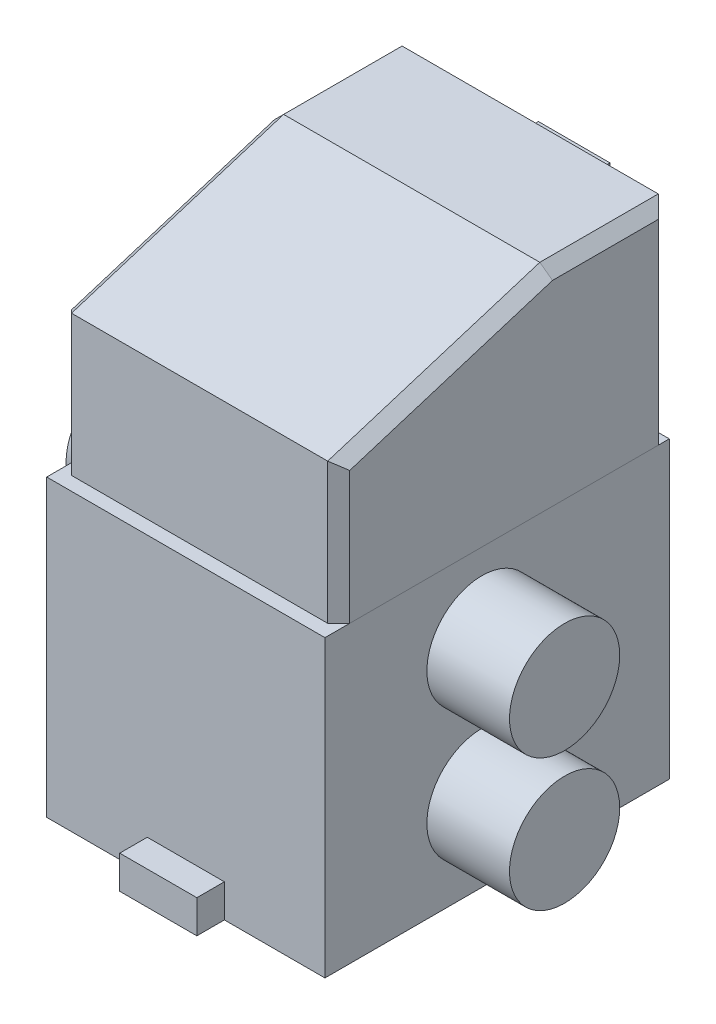
ISO-10303-21;
HEADER;
FILE_DESCRIPTION(('STEP AP214'),'2;1');
FILE_NAME('part.step','',(''),(''),'','','');
FILE_SCHEMA(('AUTOMOTIVE_DESIGN { 1 0 10303 214 1 1 1 1 }'));
ENDSEC;
DATA;
#1=APPLICATION_CONTEXT('core data for automotive mechanical design processes');
#2=APPLICATION_PROTOCOL_DEFINITION('international standard','automotive_design',2000,#1);
#3=PRODUCT_CONTEXT('',#1,'mechanical');
#4=PRODUCT('Part','Part','',(#3));
#5=PRODUCT_RELATED_PRODUCT_CATEGORY('part','',(#4));
#6=PRODUCT_DEFINITION_FORMATION('','',#4);
#7=PRODUCT_DEFINITION_CONTEXT('part definition',#1,'design');
#8=PRODUCT_DEFINITION('design','',#6,#7);
#9=PRODUCT_DEFINITION_SHAPE('','',#8);
#10=(LENGTH_UNIT() NAMED_UNIT(*) SI_UNIT(.MILLI.,.METRE.));
#11=(NAMED_UNIT(*) PLANE_ANGLE_UNIT() SI_UNIT($,.RADIAN.));
#12=(NAMED_UNIT(*) SI_UNIT($,.STERADIAN.) SOLID_ANGLE_UNIT());
#13=UNCERTAINTY_MEASURE_WITH_UNIT(LENGTH_MEASURE(1.E-05),#10,'distance_accuracy_value','');
#14=(GEOMETRIC_REPRESENTATION_CONTEXT(3) GLOBAL_UNCERTAINTY_ASSIGNED_CONTEXT((#13)) GLOBAL_UNIT_ASSIGNED_CONTEXT((#10,
#11,#12)) REPRESENTATION_CONTEXT('',''));
#15=CARTESIAN_POINT('',(0.,0.,0.));
#16=DIRECTION('',(0.,0.,1.));
#17=DIRECTION('',(1.,0.,0.));
#18=AXIS2_PLACEMENT_3D('',#15,#16,#17);
#19=CARTESIAN_POINT('',(252.5,535.,0.));
#20=DIRECTION('',(0.,0.,1.));
#21=DIRECTION('',(1.,0.,0.));
#22=AXIS2_PLACEMENT_3D('',#19,#20,#21);
#23=PLANE('',#22);
#24=DIRECTION('',(-1.,0.,0.));
#25=VECTOR('',#24,1.);
#26=CARTESIAN_POINT('',(252.5,535.,0.));
#27=LINE('',#26,#25);
#28=CARTESIAN_POINT('',(232.5,535.,0.));
#29=VERTEX_POINT('',#28);
#30=CARTESIAN_POINT('',(-232.5,535.,0.));
#31=VERTEX_POINT('',#30);
#32=EDGE_CURVE('E197',#29,#31,#27,.T.);
#33=ORIENTED_EDGE('',*,*,#32,.T.);
#34=DIRECTION('',(0.,1.,0.));
#35=VECTOR('',#34,1.);
#36=CARTESIAN_POINT('',(-232.5,535.,0.));
#37=LINE('',#36,#35);
#38=CARTESIAN_POINT('',(-232.5,910.,0.));
#39=VERTEX_POINT('',#38);
#40=EDGE_CURVE('E208',#31,#39,#37,.T.);
#41=ORIENTED_EDGE('',*,*,#40,.T.);
#42=DIRECTION('',(-1.,0.,0.));
#43=VECTOR('',#42,1.);
#44=CARTESIAN_POINT('',(252.5,910.,0.));
#45=LINE('',#44,#43);
#46=CARTESIAN_POINT('',(232.5,910.,0.));
#47=VERTEX_POINT('',#46);
#48=EDGE_CURVE('E194',#47,#39,#45,.T.);
#49=ORIENTED_EDGE('',*,*,#48,.F.);
#50=DIRECTION('',(0.,-1.,0.));
#51=VECTOR('',#50,1.);
#52=CARTESIAN_POINT('',(232.5,535.,0.));
#53=LINE('',#52,#51);
#54=EDGE_CURVE('E206',#47,#29,#53,.T.);
#55=ORIENTED_EDGE('',*,*,#54,.T.);
#56=EDGE_LOOP('',(#33,#41,#49,#55));
#57=FACE_BOUND('',#56,.T.);
#58=DIRECTION('',(0.,-1.,0.));
#59=VECTOR('',#58,1.);
#60=CARTESIAN_POINT('',(65.,835.,0.));
#61=LINE('',#60,#59);
#62=CARTESIAN_POINT('',(65.,835.,0.));
#63=VERTEX_POINT('',#62);
#64=CARTESIAN_POINT('',(65.,705.,0.));
#65=VERTEX_POINT('',#64);
#66=EDGE_CURVE('E70',#63,#65,#61,.T.);
#67=ORIENTED_EDGE('',*,*,#66,.F.);
#68=DIRECTION('',(1.,0.,0.));
#69=VECTOR('',#68,1.);
#70=CARTESIAN_POINT('',(65.,835.,0.));
#71=LINE('',#70,#69);
#72=CARTESIAN_POINT('',(-65.,835.,0.));
#73=VERTEX_POINT('',#72);
#74=EDGE_CURVE('E74',#73,#63,#71,.T.);
#75=ORIENTED_EDGE('',*,*,#74,.F.);
#76=DIRECTION('',(0.,1.,0.));
#77=VECTOR('',#76,1.);
#78=CARTESIAN_POINT('',(-65.,835.,0.));
#79=LINE('',#78,#77);
#80=CARTESIAN_POINT('',(-65.,705.,0.));
#81=VERTEX_POINT('',#80);
#82=EDGE_CURVE('E579',#81,#73,#79,.T.);
#83=ORIENTED_EDGE('',*,*,#82,.F.);
#84=DIRECTION('',(-1.,0.,0.));
#85=VECTOR('',#84,1.);
#86=CARTESIAN_POINT('',(65.,705.,0.));
#87=LINE('',#86,#85);
#88=EDGE_CURVE('E585',#65,#81,#87,.T.);
#89=ORIENTED_EDGE('',*,*,#88,.F.);
#90=EDGE_LOOP('',(#67,#75,#83,#89));
#91=FACE_BOUND('',#90,.T.);
#92=ADVANCED_FACE('F52',(#57,#91),#23,.F.);
#93=CARTESIAN_POINT('',(252.5,910.,215.));
#94=DIRECTION('',(0.,-0.954700334487348,-0.297568935424628));
#95=DIRECTION('',(0.,0.297568935424628,-0.954700334487348));
#96=AXIS2_PLACEMENT_3D('',#93,#94,#95);
#97=PLANE('',#96);
#98=DIRECTION('',(-1.,0.,0.));
#99=VECTOR('',#98,1.);
#100=CARTESIAN_POINT('',(252.5,910.,215.));
#101=LINE('',#100,#99);
#102=CARTESIAN_POINT('',(232.5,910.,215.));
#103=VERTEX_POINT('',#102);
#104=CARTESIAN_POINT('',(-232.5,910.,215.));
#105=VERTEX_POINT('',#104);
#106=EDGE_CURVE('E187',#103,#105,#101,.T.);
#107=ORIENTED_EDGE('',*,*,#106,.T.);
#108=DIRECTION('',(0.,-0.297568935424628,0.954700334487348));
#109=VECTOR('',#108,1.);
#110=CARTESIAN_POINT('',(-232.5,910.,215.));
#111=LINE('',#110,#109);
#112=CARTESIAN_POINT('',(-232.5,790.,600.));
#113=VERTEX_POINT('',#112);
#114=EDGE_CURVE('E233',#105,#113,#111,.T.);
#115=ORIENTED_EDGE('',*,*,#114,.T.);
#116=DIRECTION('',(-1.,0.,0.));
#117=VECTOR('',#116,1.);
#118=CARTESIAN_POINT('',(252.5,790.,600.));
#119=LINE('',#118,#117);
#120=CARTESIAN_POINT('',(232.5,790.,600.));
#121=VERTEX_POINT('',#120);
#122=EDGE_CURVE('E203',#121,#113,#119,.T.);
#123=ORIENTED_EDGE('',*,*,#122,.F.);
#124=DIRECTION('',(0.,0.297568935424628,-0.954700334487348));
#125=VECTOR('',#124,1.);
#126=CARTESIAN_POINT('',(232.5,910.,215.));
#127=LINE('',#126,#125);
#128=EDGE_CURVE('E231',#121,#103,#127,.T.);
#129=ORIENTED_EDGE('',*,*,#128,.T.);
#130=EDGE_LOOP('',(#107,#115,#123,#129));
#131=FACE_BOUND('',#130,.T.);
#132=ADVANCED_FACE('F297',(#131),#97,.F.);
#133=CARTESIAN_POINT('',(252.5,790.,600.));
#134=DIRECTION('',(0.,0.,-1.));
#135=DIRECTION('',(-1.,0.,0.));
#136=AXIS2_PLACEMENT_3D('',#133,#134,#135);
#137=PLANE('',#136);
#138=ORIENTED_EDGE('',*,*,#122,.T.);
#139=DIRECTION('',(0.,-1.,0.));
#140=VECTOR('',#139,1.);
#141=CARTESIAN_POINT('',(-232.5,790.,600.));
#142=LINE('',#141,#140);
#143=CARTESIAN_POINT('',(-232.5,535.,600.));
#144=VERTEX_POINT('',#143);
#145=EDGE_CURVE('E237',#113,#144,#142,.T.);
#146=ORIENTED_EDGE('',*,*,#145,.T.);
#147=DIRECTION('',(-1.,0.,0.));
#148=VECTOR('',#147,1.);
#149=CARTESIAN_POINT('',(252.5,535.,600.));
#150=LINE('',#149,#148);
#151=CARTESIAN_POINT('',(232.5,535.,600.));
#152=VERTEX_POINT('',#151);
#153=EDGE_CURVE('E200',#152,#144,#150,.T.);
#154=ORIENTED_EDGE('',*,*,#153,.F.);
#155=DIRECTION('',(0.,1.,0.));
#156=VECTOR('',#155,1.);
#157=CARTESIAN_POINT('',(232.5,790.,600.));
#158=LINE('',#157,#156);
#159=EDGE_CURVE('E235',#152,#121,#158,.T.);
#160=ORIENTED_EDGE('',*,*,#159,.T.);
#161=EDGE_LOOP('',(#138,#146,#154,#160));
#162=FACE_BOUND('',#161,.T.);
#163=ADVANCED_FACE('F309',(#162),#137,.F.);
#164=CARTESIAN_POINT('',(252.5,535.,600.));
#165=DIRECTION('',(0.,1.,0.));
#166=DIRECTION('',(0.,0.,1.));
#167=AXIS2_PLACEMENT_3D('',#164,#165,#166);
#168=PLANE('',#167);
#169=DIRECTION('',(0.,0.,-1.));
#170=VECTOR('',#169,1.);
#171=CARTESIAN_POINT('',(-252.5,535.,600.));
#172=LINE('',#171,#170);
#173=CARTESIAN_POINT('',(-252.5,535.,580.));
#174=VERTEX_POINT('',#173);
#175=CARTESIAN_POINT('',(-252.5,535.,20.0000000000001));
#176=VERTEX_POINT('',#175);
#177=EDGE_CURVE('E188',#174,#176,#172,.T.);
#178=ORIENTED_EDGE('',*,*,#177,.T.);
#179=DIRECTION('',(-0.707106781186546,0.,0.707106781186549));
#180=VECTOR('',#179,1.);
#181=CARTESIAN_POINT('',(-232.5,535.,0.));
#182=LINE('',#181,#180);
#183=EDGE_CURVE('E225',#176,#31,#182,.F.);
#184=ORIENTED_EDGE('',*,*,#183,.T.);
#185=ORIENTED_EDGE('',*,*,#32,.F.);
#186=DIRECTION('',(0.707106781186546,0.,0.707106781186549));
#187=VECTOR('',#186,1.);
#188=CARTESIAN_POINT('',(252.5,535.,20.0000000000001));
#189=LINE('',#188,#187);
#190=CARTESIAN_POINT('',(252.5,535.,20.0000000000001));
#191=VERTEX_POINT('',#190);
#192=EDGE_CURVE('E221',#29,#191,#189,.T.);
#193=ORIENTED_EDGE('',*,*,#192,.T.);
#194=DIRECTION('',(0.,0.,-1.));
#195=VECTOR('',#194,1.);
#196=CARTESIAN_POINT('',(252.5,535.,600.));
#197=LINE('',#196,#195);
#198=CARTESIAN_POINT('',(252.5,535.,580.));
#199=VERTEX_POINT('',#198);
#200=EDGE_CURVE('E184',#199,#191,#197,.T.);
#201=ORIENTED_EDGE('',*,*,#200,.F.);
#202=DIRECTION('',(-0.707106781186546,0.,0.707106781186549));
#203=VECTOR('',#202,1.);
#204=CARTESIAN_POINT('',(252.5,535.,580.));
#205=LINE('',#204,#203);
#206=EDGE_CURVE('E219',#199,#152,#205,.T.);
#207=ORIENTED_EDGE('',*,*,#206,.T.);
#208=ORIENTED_EDGE('',*,*,#153,.T.);
#209=DIRECTION('',(0.707106781186546,0.,0.707106781186549));
#210=VECTOR('',#209,1.);
#211=CARTESIAN_POINT('',(-232.5,535.,600.));
#212=LINE('',#211,#210);
#213=EDGE_CURVE('E223',#144,#174,#212,.F.);
#214=ORIENTED_EDGE('',*,*,#213,.T.);
#215=EDGE_LOOP('',(#178,#184,#185,#193,#201,#207,#208,#214));
#216=FACE_BOUND('',#215,.T.);
#217=ADVANCED_FACE('F270',(#216),#168,.F.);
#218=CARTESIAN_POINT('',(252.5,910.,0.));
#219=DIRECTION('',(0.,-1.,0.));
#220=DIRECTION('',(0.,0.,-1.));
#221=AXIS2_PLACEMENT_3D('',#218,#219,#220);
#222=PLANE('',#221);
#223=ORIENTED_EDGE('',*,*,#48,.T.);
#224=DIRECTION('',(0.,0.,1.));
#225=VECTOR('',#224,1.);
#226=CARTESIAN_POINT('',(-232.5,910.,0.));
#227=LINE('',#226,#225);
#228=EDGE_CURVE('E229',#39,#105,#227,.T.);
#229=ORIENTED_EDGE('',*,*,#228,.T.);
#230=ORIENTED_EDGE('',*,*,#106,.F.);
#231=DIRECTION('',(0.,0.,-1.));
#232=VECTOR('',#231,1.);
#233=CARTESIAN_POINT('',(232.5,910.,0.));
#234=LINE('',#233,#232);
#235=EDGE_CURVE('E227',#103,#47,#234,.T.);
#236=ORIENTED_EDGE('',*,*,#235,.T.);
#237=EDGE_LOOP('',(#223,#229,#230,#236));
#238=FACE_BOUND('',#237,.T.);
#239=ADVANCED_FACE('F282',(#238),#222,.F.);
#240=CARTESIAN_POINT('',(252.5,0.,0.));
#241=DIRECTION('',(1.,0.,0.));
#242=DIRECTION('',(0.,0.,-1.));
#243=AXIS2_PLACEMENT_3D('',#240,#241,#242);
#244=PLANE('',#243);
#245=ORIENTED_EDGE('',*,*,#200,.T.);
#246=DIRECTION('',(0.,1.,0.));
#247=VECTOR('',#246,1.);
#248=CARTESIAN_POINT('',(252.5,910.,20.0000000000001));
#249=LINE('',#248,#247);
#250=CARTESIAN_POINT('',(252.5,890.,20.0000000000001));
#251=VERTEX_POINT('',#250);
#252=EDGE_CURVE('E12',#191,#251,#249,.T.);
#253=ORIENTED_EDGE('',*,*,#252,.T.);
#254=DIRECTION('',(0.,0.,1.));
#255=VECTOR('',#254,1.);
#256=CARTESIAN_POINT('',(252.5,890.,215.));
#257=LINE('',#256,#255);
#258=CARTESIAN_POINT('',(252.5,890.,211.955349828569));
#259=VERTEX_POINT('',#258);
#260=EDGE_CURVE('E62',#251,#259,#257,.T.);
#261=ORIENTED_EDGE('',*,*,#260,.T.);
#262=DIRECTION('',(0.,-0.297568935424628,0.954700334487348));
#263=VECTOR('',#262,1.);
#264=CARTESIAN_POINT('',(252.5,770.905993310253,594.048621291507));
#265=LINE('',#264,#263);
#266=CARTESIAN_POINT('',(252.5,775.284784362151,580.));
#267=VERTEX_POINT('',#266);
#268=EDGE_CURVE('E241',#259,#267,#265,.T.);
#269=ORIENTED_EDGE('',*,*,#268,.T.);
#270=DIRECTION('',(0.,-1.,0.));
#271=VECTOR('',#270,1.);
#272=CARTESIAN_POINT('',(252.5,535.,580.));
#273=LINE('',#272,#271);
#274=EDGE_CURVE('E239',#267,#199,#273,.T.);
#275=ORIENTED_EDGE('',*,*,#274,.T.);
#276=EDGE_LOOP('',(#245,#253,#261,#269,#275));
#277=FACE_BOUND('',#276,.T.);
#278=ADVANCED_FACE('F267',(#277),#244,.T.);
#279=CARTESIAN_POINT('',(-252.5,0.,0.));
#280=DIRECTION('',(1.,0.,0.));
#281=DIRECTION('',(0.,0.,-1.));
#282=AXIS2_PLACEMENT_3D('',#279,#280,#281);
#283=PLANE('',#282);
#284=DIRECTION('',(0.,0.,-1.));
#285=VECTOR('',#284,1.);
#286=CARTESIAN_POINT('',(-252.5,890.,0.));
#287=LINE('',#286,#285);
#288=CARTESIAN_POINT('',(-252.5,890.,211.955349828569));
#289=VERTEX_POINT('',#288);
#290=CARTESIAN_POINT('',(-252.5,890.,20.0000000000001));
#291=VERTEX_POINT('',#290);
#292=EDGE_CURVE('E215',#289,#291,#287,.T.);
#293=ORIENTED_EDGE('',*,*,#292,.T.);
#294=DIRECTION('',(0.,-1.,0.));
#295=VECTOR('',#294,1.);
#296=CARTESIAN_POINT('',(-252.5,0.,20.0000000000001));
#297=LINE('',#296,#295);
#298=EDGE_CURVE('E217',#291,#176,#297,.T.);
#299=ORIENTED_EDGE('',*,*,#298,.T.);
#300=ORIENTED_EDGE('',*,*,#177,.F.);
#301=DIRECTION('',(0.,1.,0.));
#302=VECTOR('',#301,1.);
#303=CARTESIAN_POINT('',(-252.5,0.,580.));
#304=LINE('',#303,#302);
#305=CARTESIAN_POINT('',(-252.5,775.284784362151,580.));
#306=VERTEX_POINT('',#305);
#307=EDGE_CURVE('E211',#174,#306,#304,.T.);
#308=ORIENTED_EDGE('',*,*,#307,.T.);
#309=DIRECTION('',(0.,0.297568935424628,-0.954700334487348));
#310=VECTOR('',#309,1.);
#311=CARTESIAN_POINT('',(-252.5,871.407146269515,271.607422213875));
#312=LINE('',#311,#310);
#313=EDGE_CURVE('E213',#306,#289,#312,.T.);
#314=ORIENTED_EDGE('',*,*,#313,.T.);
#315=EDGE_LOOP('',(#293,#299,#300,#308,#314));
#316=FACE_BOUND('',#315,.T.);
#317=ADVANCED_FACE('F312',(#316),#283,.F.);
#318=CARTESIAN_POINT('',(-232.5,790.,600.));
#319=DIRECTION('',(0.707106781186549,0.,-0.707106781186545));
#320=DIRECTION('',(0.,-1.,0.));
#321=AXIS2_PLACEMENT_3D('',#318,#319,#320);
#322=PLANE('',#321);
#323=ORIENTED_EDGE('',*,*,#213,.F.);
#324=ORIENTED_EDGE('',*,*,#145,.F.);
#325=DIRECTION('',(-0.627289875797286,-0.461535289489815,-0.627289875797289));
#326=VECTOR('',#325,1.);
#327=CARTESIAN_POINT('',(-232.5,790.,600.));
#328=LINE('',#327,#326);
#329=EDGE_CURVE('E191',#306,#113,#328,.F.);
#330=ORIENTED_EDGE('',*,*,#329,.F.);
#331=ORIENTED_EDGE('',*,*,#307,.F.);
#332=EDGE_LOOP('',(#323,#324,#330,#331));
#333=FACE_BOUND('',#332,.T.);
#334=ADVANCED_FACE('F307',(#333),#322,.F.);
#335=CARTESIAN_POINT('',(-232.5,910.,215.));
#336=DIRECTION('',(0.707106781186549,-0.675075080517068,-0.210413012109216));
#337=DIRECTION('',(0.,-0.297568935424628,0.954700334487348));
#338=AXIS2_PLACEMENT_3D('',#335,#336,#337);
#339=PLANE('',#338);
#340=ORIENTED_EDGE('',*,*,#329,.T.);
#341=ORIENTED_EDGE('',*,*,#114,.F.);
#342=DIRECTION('',(-0.703045290429658,-0.703045290429662,-0.107026348201505));
#343=VECTOR('',#342,1.);
#344=CARTESIAN_POINT('',(-232.5,910.,215.));
#345=LINE('',#344,#343);
#346=EDGE_CURVE('E246',#289,#105,#345,.F.);
#347=ORIENTED_EDGE('',*,*,#346,.F.);
#348=ORIENTED_EDGE('',*,*,#313,.F.);
#349=EDGE_LOOP('',(#340,#341,#347,#348));
#350=FACE_BOUND('',#349,.T.);
#351=ADVANCED_FACE('F300',(#350),#339,.F.);
#352=CARTESIAN_POINT('',(-232.5,910.,0.));
#353=DIRECTION('',(0.707106781186549,-0.707106781186545,0.));
#354=DIRECTION('',(0.,0.,1.));
#355=AXIS2_PLACEMENT_3D('',#352,#353,#354);
#356=PLANE('',#355);
#357=ORIENTED_EDGE('',*,*,#346,.T.);
#358=ORIENTED_EDGE('',*,*,#228,.F.);
#359=DIRECTION('',(-0.577350269189624,-0.577350269189627,0.577350269189627));
#360=VECTOR('',#359,1.);
#361=CARTESIAN_POINT('',(-232.5,910.,0.));
#362=LINE('',#361,#360);
#363=EDGE_CURVE('E244',#291,#39,#362,.F.);
#364=ORIENTED_EDGE('',*,*,#363,.F.);
#365=ORIENTED_EDGE('',*,*,#292,.F.);
#366=EDGE_LOOP('',(#357,#358,#364,#365));
#367=FACE_BOUND('',#366,.T.);
#368=ADVANCED_FACE('F293',(#367),#356,.F.);
#369=CARTESIAN_POINT('',(-232.5,535.,0.));
#370=DIRECTION('',(0.707106781186549,0.,0.707106781186545));
#371=DIRECTION('',(0.,1.,0.));
#372=AXIS2_PLACEMENT_3D('',#369,#370,#371);
#373=PLANE('',#372);
#374=ORIENTED_EDGE('',*,*,#183,.F.);
#375=ORIENTED_EDGE('',*,*,#298,.F.);
#376=ORIENTED_EDGE('',*,*,#363,.T.);
#377=ORIENTED_EDGE('',*,*,#40,.F.);
#378=EDGE_LOOP('',(#374,#375,#376,#377));
#379=FACE_BOUND('',#378,.T.);
#380=ADVANCED_FACE('F287',(#379),#373,.F.);
#381=CARTESIAN_POINT('',(252.5,0.,580.));
#382=DIRECTION('',(0.707106781186549,0.,0.707106781186545));
#383=DIRECTION('',(0.,1.,0.));
#384=AXIS2_PLACEMENT_3D('',#381,#382,#383);
#385=PLANE('',#384);
#386=ORIENTED_EDGE('',*,*,#206,.F.);
#387=ORIENTED_EDGE('',*,*,#274,.F.);
#388=DIRECTION('',(-0.627289875797286,0.461535289489815,0.627289875797289));
#389=VECTOR('',#388,1.);
#390=CARTESIAN_POINT('',(476.957670923014,610.137632902081,355.542329076985));
#391=LINE('',#390,#389);
#392=EDGE_CURVE('E57',#121,#267,#391,.F.);
#393=ORIENTED_EDGE('',*,*,#392,.F.);
#394=ORIENTED_EDGE('',*,*,#159,.F.);
#395=EDGE_LOOP('',(#386,#387,#393,#394));
#396=FACE_BOUND('',#395,.T.);
#397=ADVANCED_FACE('F55',(#396),#385,.T.);
#398=CARTESIAN_POINT('',(252.5,871.407146269515,271.607422213875));
#399=DIRECTION('',(0.707106781186549,0.675075080517068,0.210413012109216));
#400=DIRECTION('',(0.,0.297568935424628,-0.954700334487348));
#401=AXIS2_PLACEMENT_3D('',#398,#399,#400);
#402=PLANE('',#401);
#403=ORIENTED_EDGE('',*,*,#392,.T.);
#404=ORIENTED_EDGE('',*,*,#268,.F.);
#405=DIRECTION('',(-0.703045290429658,0.703045290429662,0.107026348201505));
#406=VECTOR('',#405,1.);
#407=CARTESIAN_POINT('',(257.20145704046,885.29854295954,211.239635229359));
#408=LINE('',#407,#406);
#409=EDGE_CURVE('E178',#103,#259,#408,.F.);
#410=ORIENTED_EDGE('',*,*,#409,.F.);
#411=ORIENTED_EDGE('',*,*,#128,.F.);
#412=EDGE_LOOP('',(#403,#404,#410,#411));
#413=FACE_BOUND('',#412,.T.);
#414=ADVANCED_FACE('F260',(#413),#402,.T.);
#415=CARTESIAN_POINT('',(252.5,890.,0.));
#416=DIRECTION('',(0.707106781186549,0.707106781186545,0.));
#417=DIRECTION('',(0.,0.,-1.));
#418=AXIS2_PLACEMENT_3D('',#415,#416,#417);
#419=PLANE('',#418);
#420=ORIENTED_EDGE('',*,*,#409,.T.);
#421=ORIENTED_EDGE('',*,*,#260,.F.);
#422=DIRECTION('',(-0.577350269189624,0.577350269189627,-0.577350269189627));
#423=VECTOR('',#422,1.);
#424=CARTESIAN_POINT('',(245.833333333333,896.666666666667,13.3333333333334));
#425=LINE('',#424,#423);
#426=EDGE_CURVE('E176',#47,#251,#425,.F.);
#427=ORIENTED_EDGE('',*,*,#426,.F.);
#428=ORIENTED_EDGE('',*,*,#235,.F.);
#429=EDGE_LOOP('',(#420,#421,#427,#428));
#430=FACE_BOUND('',#429,.T.);
#431=ADVANCED_FACE('F278',(#430),#419,.T.);
#432=CARTESIAN_POINT('',(252.5,0.,20.0000000000001));
#433=DIRECTION('',(0.707106781186549,0.,-0.707106781186545));
#434=DIRECTION('',(0.,-1.,0.));
#435=AXIS2_PLACEMENT_3D('',#432,#433,#434);
#436=PLANE('',#435);
#437=ORIENTED_EDGE('',*,*,#192,.F.);
#438=ORIENTED_EDGE('',*,*,#54,.F.);
#439=ORIENTED_EDGE('',*,*,#426,.T.);
#440=ORIENTED_EDGE('',*,*,#252,.F.);
#441=EDGE_LOOP('',(#437,#438,#439,#440));
#442=FACE_BOUND('',#441,.T.);
#443=ADVANCED_FACE('F276',(#442),#436,.T.);
#444=CARTESIAN_POINT('',(65.,835.,-80.));
#445=DIRECTION('',(-1.,0.,0.));
#446=DIRECTION('',(0.,-1.,0.));
#447=AXIS2_PLACEMENT_3D('',#444,#445,#446);
#448=PLANE('',#447);
#449=ORIENTED_EDGE('',*,*,#66,.T.);
#450=DIRECTION('',(0.,0.,1.));
#451=VECTOR('',#450,1.);
#452=CARTESIAN_POINT('',(65.,705.,-80.));
#453=LINE('',#452,#451);
#454=CARTESIAN_POINT('',(65.,705.,-80.));
#455=VERTEX_POINT('',#454);
#456=EDGE_CURVE('E159',#455,#65,#453,.T.);
#457=ORIENTED_EDGE('',*,*,#456,.F.);
#458=DIRECTION('',(0.,-1.,0.));
#459=VECTOR('',#458,1.);
#460=CARTESIAN_POINT('',(65.,835.,-80.));
#461=LINE('',#460,#459);
#462=CARTESIAN_POINT('',(65.,835.,-80.));
#463=VERTEX_POINT('',#462);
#464=EDGE_CURVE('E165',#463,#455,#461,.T.);
#465=ORIENTED_EDGE('',*,*,#464,.F.);
#466=DIRECTION('',(0.,0.,1.));
#467=VECTOR('',#466,1.);
#468=CARTESIAN_POINT('',(65.,835.,-80.));
#469=LINE('',#468,#467);
#470=EDGE_CURVE('E577',#463,#63,#469,.T.);
#471=ORIENTED_EDGE('',*,*,#470,.T.);
#472=EDGE_LOOP('',(#449,#457,#465,#471));
#473=FACE_BOUND('',#472,.T.);
#474=ADVANCED_FACE('F175',(#473),#448,.F.);
#475=CARTESIAN_POINT('',(65.,705.,-80.));
#476=DIRECTION('',(0.,1.,0.));
#477=DIRECTION('',(0.,0.,1.));
#478=AXIS2_PLACEMENT_3D('',#475,#476,#477);
#479=PLANE('',#478);
#480=ORIENTED_EDGE('',*,*,#88,.T.);
#481=DIRECTION('',(0.,0.,1.));
#482=VECTOR('',#481,1.);
#483=CARTESIAN_POINT('',(-65.,705.,-80.));
#484=LINE('',#483,#482);
#485=CARTESIAN_POINT('',(-65.,705.,-80.));
#486=VERTEX_POINT('',#485);
#487=EDGE_CURVE('E161',#486,#81,#484,.T.);
#488=ORIENTED_EDGE('',*,*,#487,.F.);
#489=DIRECTION('',(-1.,0.,0.));
#490=VECTOR('',#489,1.);
#491=CARTESIAN_POINT('',(65.,705.,-80.));
#492=LINE('',#491,#490);
#493=EDGE_CURVE('E154',#455,#486,#492,.T.);
#494=ORIENTED_EDGE('',*,*,#493,.F.);
#495=ORIENTED_EDGE('',*,*,#456,.T.);
#496=EDGE_LOOP('',(#480,#488,#494,#495));
#497=FACE_BOUND('',#496,.T.);
#498=ADVANCED_FACE('F157',(#497),#479,.F.);
#499=CARTESIAN_POINT('',(-65.,835.,-80.));
#500=DIRECTION('',(1.,0.,0.));
#501=DIRECTION('',(0.,1.,0.));
#502=AXIS2_PLACEMENT_3D('',#499,#500,#501);
#503=PLANE('',#502);
#504=ORIENTED_EDGE('',*,*,#82,.T.);
#505=DIRECTION('',(0.,0.,1.));
#506=VECTOR('',#505,1.);
#507=CARTESIAN_POINT('',(-65.,835.,-80.));
#508=LINE('',#507,#506);
#509=CARTESIAN_POINT('',(-65.,835.,-80.));
#510=VERTEX_POINT('',#509);
#511=EDGE_CURVE('E180',#510,#73,#508,.T.);
#512=ORIENTED_EDGE('',*,*,#511,.F.);
#513=DIRECTION('',(0.,1.,0.));
#514=VECTOR('',#513,1.);
#515=CARTESIAN_POINT('',(-65.,835.,-80.));
#516=LINE('',#515,#514);
#517=EDGE_CURVE('E164',#486,#510,#516,.T.);
#518=ORIENTED_EDGE('',*,*,#517,.F.);
#519=ORIENTED_EDGE('',*,*,#487,.T.);
#520=EDGE_LOOP('',(#504,#512,#518,#519));
#521=FACE_BOUND('',#520,.T.);
#522=ADVANCED_FACE('F452',(#521),#503,.F.);
#523=CARTESIAN_POINT('',(65.,835.,-80.));
#524=DIRECTION('',(0.,-1.,0.));
#525=DIRECTION('',(0.,0.,-1.));
#526=AXIS2_PLACEMENT_3D('',#523,#524,#525);
#527=PLANE('',#526);
#528=ORIENTED_EDGE('',*,*,#74,.T.);
#529=ORIENTED_EDGE('',*,*,#470,.F.);
#530=DIRECTION('',(1.,0.,0.));
#531=VECTOR('',#530,1.);
#532=CARTESIAN_POINT('',(65.,835.,-80.));
#533=LINE('',#532,#531);
#534=EDGE_CURVE('E170',#510,#463,#533,.T.);
#535=ORIENTED_EDGE('',*,*,#534,.F.);
#536=ORIENTED_EDGE('',*,*,#511,.T.);
#537=EDGE_LOOP('',(#528,#529,#535,#536));
#538=FACE_BOUND('',#537,.T.);
#539=ADVANCED_FACE('F463',(#538),#527,.F.);
#540=CARTESIAN_POINT('',(0.,0.,-80.));
#541=DIRECTION('',(0.,0.,-1.));
#542=DIRECTION('',(-1.,0.,0.));
#543=AXIS2_PLACEMENT_3D('',#540,#541,#542);
#544=PLANE('',#543);
#545=ORIENTED_EDGE('',*,*,#464,.T.);
#546=ORIENTED_EDGE('',*,*,#493,.T.);
#547=ORIENTED_EDGE('',*,*,#517,.T.);
#548=ORIENTED_EDGE('',*,*,#534,.T.);
#549=EDGE_LOOP('',(#545,#546,#547,#548));
#550=FACE_BOUND('',#549,.T.);
#551=ADVANCED_FACE('F168',(#550),#544,.T.);
#552=CLOSED_SHELL('',(#92,#132,#163,#217,#239,#278,#317,#334,#351,#368,#380,#397,#414,#431,#443,
#474,#498,#522,#539,#551));
#553=MANIFOLD_SOLID_BREP('B2',#552);
#554=CARTESIAN_POINT('',(402.5,150.,340.));
#555=DIRECTION('',(-1.,0.,0.));
#556=DIRECTION('',(0.,0.,1.));
#557=AXIS2_PLACEMENT_3D('',#554,#555,#556);
#558=CYLINDRICAL_SURFACE('',#557,100.);
#559=CARTESIAN_POINT('',(402.5,150.,340.));
#560=DIRECTION('',(1.,0.,0.));
#561=DIRECTION('',(0.,0.,-1.));
#562=AXIS2_PLACEMENT_3D('',#559,#560,#561);
#563=CIRCLE('',#562,100.);
#564=CARTESIAN_POINT('',(402.5,150.,240.));
#565=VERTEX_POINT('',#564);
#566=EDGE_CURVE('E605',#565,#565,#563,.T.);
#567=ORIENTED_EDGE('',*,*,#566,.F.);
#568=EDGE_LOOP('',(#567));
#569=FACE_BOUND('',#568,.T.);
#570=CARTESIAN_POINT('',(252.5,150.,340.));
#571=DIRECTION('',(1.,0.,0.));
#572=DIRECTION('',(0.,0.,-1.));
#573=AXIS2_PLACEMENT_3D('',#570,#571,#572);
#574=CIRCLE('',#573,100.);
#575=CARTESIAN_POINT('',(252.5,150.,240.));
#576=VERTEX_POINT('',#575);
#577=EDGE_CURVE('E51',#576,#576,#574,.T.);
#578=ORIENTED_EDGE('',*,*,#577,.T.);
#579=EDGE_LOOP('',(#578));
#580=FACE_BOUND('',#579,.T.);
#581=ADVANCED_FACE('F601',(#569,#580),#558,.T.);
#582=CARTESIAN_POINT('',(402.5,150.,340.));
#583=DIRECTION('',(1.,0.,0.));
#584=DIRECTION('',(0.,0.,-1.));
#585=AXIS2_PLACEMENT_3D('',#582,#583,#584);
#586=PLANE('',#585);
#587=ORIENTED_EDGE('',*,*,#566,.T.);
#588=EDGE_LOOP('',(#587));
#589=FACE_BOUND('',#588,.T.);
#590=ADVANCED_FACE('F603',(#589),#586,.T.);
#591=CARTESIAN_POINT('',(252.5,150.,340.));
#592=DIRECTION('',(1.,0.,0.));
#593=DIRECTION('',(0.,0.,-1.));
#594=AXIS2_PLACEMENT_3D('',#591,#592,#593);
#595=PLANE('',#594);
#596=ORIENTED_EDGE('',*,*,#577,.F.);
#597=EDGE_LOOP('',(#596));
#598=FACE_BOUND('',#597,.T.);
#599=ADVANCED_FACE('F620',(#598),#595,.F.);
#600=CLOSED_SHELL('',(#581,#590,#599));
#601=MANIFOLD_SOLID_BREP('B6',#600);
#602=CARTESIAN_POINT('',(402.5,390.,340.));
#603=DIRECTION('',(-1.,0.,0.));
#604=DIRECTION('',(0.,0.,1.));
#605=AXIS2_PLACEMENT_3D('',#602,#603,#604);
#606=CYLINDRICAL_SURFACE('',#605,100.);
#607=CARTESIAN_POINT('',(402.5,390.,340.));
#608=DIRECTION('',(1.,0.,0.));
#609=DIRECTION('',(0.,0.,-1.));
#610=AXIS2_PLACEMENT_3D('',#607,#608,#609);
#611=CIRCLE('',#610,100.);
#612=CARTESIAN_POINT('',(402.5,390.,240.));
#613=VERTEX_POINT('',#612);
#614=EDGE_CURVE('E600',#613,#613,#611,.T.);
#615=ORIENTED_EDGE('',*,*,#614,.F.);
#616=EDGE_LOOP('',(#615));
#617=FACE_BOUND('',#616,.T.);
#618=CARTESIAN_POINT('',(252.5,390.,340.));
#619=DIRECTION('',(1.,0.,0.));
#620=DIRECTION('',(0.,0.,-1.));
#621=AXIS2_PLACEMENT_3D('',#618,#619,#620);
#622=CIRCLE('',#621,100.);
#623=CARTESIAN_POINT('',(252.5,390.,240.));
#624=VERTEX_POINT('',#623);
#625=EDGE_CURVE('E665',#624,#624,#622,.T.);
#626=ORIENTED_EDGE('',*,*,#625,.T.);
#627=EDGE_LOOP('',(#626));
#628=FACE_BOUND('',#627,.T.);
#629=ADVANCED_FACE('F662',(#617,#628),#606,.T.);
#630=CARTESIAN_POINT('',(402.5,390.,340.));
#631=DIRECTION('',(1.,0.,0.));
#632=DIRECTION('',(0.,0.,-1.));
#633=AXIS2_PLACEMENT_3D('',#630,#631,#632);
#634=PLANE('',#633);
#635=ORIENTED_EDGE('',*,*,#614,.T.);
#636=EDGE_LOOP('',(#635));
#637=FACE_BOUND('',#636,.T.);
#638=ADVANCED_FACE('F677',(#637),#634,.T.);
#639=CARTESIAN_POINT('',(252.5,390.,340.));
#640=DIRECTION('',(1.,0.,0.));
#641=DIRECTION('',(0.,0.,-1.));
#642=AXIS2_PLACEMENT_3D('',#639,#640,#641);
#643=PLANE('',#642);
#644=ORIENTED_EDGE('',*,*,#625,.F.);
#645=EDGE_LOOP('',(#644));
#646=FACE_BOUND('',#645,.T.);
#647=ADVANCED_FACE('F675',(#646),#643,.F.);
#648=CLOSED_SHELL('',(#629,#638,#647));
#649=MANIFOLD_SOLID_BREP('B46',#648);
#650=CARTESIAN_POINT('',(-402.5,150.,340.));
#651=DIRECTION('',(1.,0.,0.));
#652=DIRECTION('',(0.,0.,-1.));
#653=AXIS2_PLACEMENT_3D('',#650,#651,#652);
#654=CYLINDRICAL_SURFACE('',#653,100.);
#655=CARTESIAN_POINT('',(-402.5,150.,340.));
#656=DIRECTION('',(-1.,0.,0.));
#657=DIRECTION('',(0.,0.,1.));
#658=AXIS2_PLACEMENT_3D('',#655,#656,#657);
#659=CIRCLE('',#658,100.);
#660=CARTESIAN_POINT('',(-402.5,150.,440.));
#661=VERTEX_POINT('',#660);
#662=EDGE_CURVE('E727',#661,#661,#659,.T.);
#663=ORIENTED_EDGE('',*,*,#662,.F.);
#664=EDGE_LOOP('',(#663));
#665=FACE_BOUND('',#664,.T.);
#666=CARTESIAN_POINT('',(-252.5,150.,340.));
#667=DIRECTION('',(-1.,0.,0.));
#668=DIRECTION('',(0.,0.,1.));
#669=AXIS2_PLACEMENT_3D('',#666,#667,#668);
#670=CIRCLE('',#669,100.);
#671=CARTESIAN_POINT('',(-252.5,150.,440.));
#672=VERTEX_POINT('',#671);
#673=EDGE_CURVE('E661',#672,#672,#670,.T.);
#674=ORIENTED_EDGE('',*,*,#673,.T.);
#675=EDGE_LOOP('',(#674));
#676=FACE_BOUND('',#675,.T.);
#677=ADVANCED_FACE('F723',(#665,#676),#654,.T.);
#678=CARTESIAN_POINT('',(-402.5,150.,340.));
#679=DIRECTION('',(-1.,0.,0.));
#680=DIRECTION('',(0.,0.,1.));
#681=AXIS2_PLACEMENT_3D('',#678,#679,#680);
#682=PLANE('',#681);
#683=ORIENTED_EDGE('',*,*,#662,.T.);
#684=EDGE_LOOP('',(#683));
#685=FACE_BOUND('',#684,.T.);
#686=ADVANCED_FACE('F725',(#685),#682,.T.);
#687=CARTESIAN_POINT('',(-252.5,150.,340.));
#688=DIRECTION('',(-1.,0.,0.));
#689=DIRECTION('',(0.,0.,1.));
#690=AXIS2_PLACEMENT_3D('',#687,#688,#689);
#691=PLANE('',#690);
#692=ORIENTED_EDGE('',*,*,#673,.F.);
#693=EDGE_LOOP('',(#692));
#694=FACE_BOUND('',#693,.T.);
#695=ADVANCED_FACE('F742',(#694),#691,.F.);
#696=CLOSED_SHELL('',(#677,#686,#695));
#697=MANIFOLD_SOLID_BREP('B595',#696);
#698=CARTESIAN_POINT('',(-402.5,190.,95.));
#699=DIRECTION('',(1.,0.,0.));
#700=DIRECTION('',(0.,0.,-1.));
#701=AXIS2_PLACEMENT_3D('',#698,#699,#700);
#702=CYLINDRICAL_SURFACE('',#701,100.);
#703=CARTESIAN_POINT('',(-402.5,190.,95.));
#704=DIRECTION('',(-1.,0.,0.));
#705=DIRECTION('',(0.,0.,1.));
#706=AXIS2_PLACEMENT_3D('',#703,#704,#705);
#707=CIRCLE('',#706,100.);
#708=CARTESIAN_POINT('',(-402.5,190.,195.));
#709=VERTEX_POINT('',#708);
#710=EDGE_CURVE('E788',#709,#709,#707,.T.);
#711=ORIENTED_EDGE('',*,*,#710,.F.);
#712=EDGE_LOOP('',(#711));
#713=FACE_BOUND('',#712,.T.);
#714=CARTESIAN_POINT('',(-252.5,190.,95.));
#715=DIRECTION('',(-1.,0.,0.));
#716=DIRECTION('',(0.,0.,1.));
#717=AXIS2_PLACEMENT_3D('',#714,#715,#716);
#718=CIRCLE('',#717,100.);
#719=CARTESIAN_POINT('',(-252.5,190.,195.));
#720=VERTEX_POINT('',#719);
#721=EDGE_CURVE('E722',#720,#720,#718,.T.);
#722=ORIENTED_EDGE('',*,*,#721,.T.);
#723=EDGE_LOOP('',(#722));
#724=FACE_BOUND('',#723,.T.);
#725=ADVANCED_FACE('F784',(#713,#724),#702,.T.);
#726=CARTESIAN_POINT('',(-402.5,190.,95.));
#727=DIRECTION('',(-1.,0.,0.));
#728=DIRECTION('',(0.,0.,1.));
#729=AXIS2_PLACEMENT_3D('',#726,#727,#728);
#730=PLANE('',#729);
#731=ORIENTED_EDGE('',*,*,#710,.T.);
#732=EDGE_LOOP('',(#731));
#733=FACE_BOUND('',#732,.T.);
#734=ADVANCED_FACE('F786',(#733),#730,.T.);
#735=CARTESIAN_POINT('',(-252.5,190.,95.));
#736=DIRECTION('',(-1.,0.,0.));
#737=DIRECTION('',(0.,0.,1.));
#738=AXIS2_PLACEMENT_3D('',#735,#736,#737);
#739=PLANE('',#738);
#740=ORIENTED_EDGE('',*,*,#721,.F.);
#741=EDGE_LOOP('',(#740));
#742=FACE_BOUND('',#741,.T.);
#743=ADVANCED_FACE('F803',(#742),#739,.F.);
#744=CLOSED_SHELL('',(#725,#734,#743));
#745=MANIFOLD_SOLID_BREP('B656',#744);
#746=CARTESIAN_POINT('',(-402.5,390.,340.));
#747=DIRECTION('',(1.,0.,0.));
#748=DIRECTION('',(0.,0.,-1.));
#749=AXIS2_PLACEMENT_3D('',#746,#747,#748);
#750=CYLINDRICAL_SURFACE('',#749,100.);
#751=CARTESIAN_POINT('',(-402.5,390.,340.));
#752=DIRECTION('',(-1.,0.,0.));
#753=DIRECTION('',(0.,0.,1.));
#754=AXIS2_PLACEMENT_3D('',#751,#752,#753);
#755=CIRCLE('',#754,100.);
#756=CARTESIAN_POINT('',(-402.5,390.,440.));
#757=VERTEX_POINT('',#756);
#758=EDGE_CURVE('E783',#757,#757,#755,.T.);
#759=ORIENTED_EDGE('',*,*,#758,.F.);
#760=EDGE_LOOP('',(#759));
#761=FACE_BOUND('',#760,.T.);
#762=CARTESIAN_POINT('',(-252.5,390.,340.));
#763=DIRECTION('',(-1.,0.,0.));
#764=DIRECTION('',(0.,0.,1.));
#765=AXIS2_PLACEMENT_3D('',#762,#763,#764);
#766=CIRCLE('',#765,100.);
#767=CARTESIAN_POINT('',(-252.5,390.,440.));
#768=VERTEX_POINT('',#767);
#769=EDGE_CURVE('E849',#768,#768,#766,.T.);
#770=ORIENTED_EDGE('',*,*,#769,.T.);
#771=EDGE_LOOP('',(#770));
#772=FACE_BOUND('',#771,.T.);
#773=ADVANCED_FACE('F846',(#761,#772),#750,.T.);
#774=CARTESIAN_POINT('',(-402.5,390.,340.));
#775=DIRECTION('',(-1.,0.,0.));
#776=DIRECTION('',(0.,0.,1.));
#777=AXIS2_PLACEMENT_3D('',#774,#775,#776);
#778=PLANE('',#777);
#779=ORIENTED_EDGE('',*,*,#758,.T.);
#780=EDGE_LOOP('',(#779));
#781=FACE_BOUND('',#780,.T.);
#782=ADVANCED_FACE('F861',(#781),#778,.T.);
#783=CARTESIAN_POINT('',(-252.5,390.,340.));
#784=DIRECTION('',(-1.,0.,0.));
#785=DIRECTION('',(0.,0.,1.));
#786=AXIS2_PLACEMENT_3D('',#783,#784,#785);
#787=PLANE('',#786);
#788=ORIENTED_EDGE('',*,*,#769,.F.);
#789=EDGE_LOOP('',(#788));
#790=FACE_BOUND('',#789,.T.);
#791=ADVANCED_FACE('F859',(#790),#787,.F.);
#792=CLOSED_SHELL('',(#773,#782,#791));
#793=MANIFOLD_SOLID_BREP('B717',#792);
#794=CARTESIAN_POINT('',(0.,0.,625.));
#795=DIRECTION('',(0.,0.,-1.));
#796=DIRECTION('',(-1.,0.,0.));
#797=AXIS2_PLACEMENT_3D('',#794,#795,#796);
#798=PLANE('',#797);
#799=DIRECTION('',(0.,1.,0.));
#800=VECTOR('',#799,1.);
#801=CARTESIAN_POINT('',(70.,0.,625.));
#802=LINE('',#801,#800);
#803=CARTESIAN_POINT('',(70.,0.,625.));
#804=VERTEX_POINT('',#803);
#805=CARTESIAN_POINT('',(70.,60.,625.));
#806=VERTEX_POINT('',#805);
#807=EDGE_CURVE('E844',#804,#806,#802,.T.);
#808=ORIENTED_EDGE('',*,*,#807,.F.);
#809=DIRECTION('',(1.,0.,0.));
#810=VECTOR('',#809,1.);
#811=CARTESIAN_POINT('',(-252.5,0.,625.));
#812=LINE('',#811,#810);
#813=CARTESIAN_POINT('',(252.5,0.,625.));
#814=VERTEX_POINT('',#813);
#815=EDGE_CURVE('E1004',#804,#814,#812,.T.);
#816=ORIENTED_EDGE('',*,*,#815,.T.);
#817=DIRECTION('',(0.,1.,0.));
#818=VECTOR('',#817,1.);
#819=CARTESIAN_POINT('',(252.5,0.,625.));
#820=LINE('',#819,#818);
#821=CARTESIAN_POINT('',(252.5,535.,625.));
#822=VERTEX_POINT('',#821);
#823=EDGE_CURVE('E1006',#814,#822,#820,.T.);
#824=ORIENTED_EDGE('',*,*,#823,.T.);
#825=DIRECTION('',(-1.,0.,0.));
#826=VECTOR('',#825,1.);
#827=CARTESIAN_POINT('',(-252.5,535.,625.));
#828=LINE('',#827,#826);
#829=CARTESIAN_POINT('',(-252.5,535.,625.));
#830=VERTEX_POINT('',#829);
#831=EDGE_CURVE('E922',#822,#830,#828,.T.);
#832=ORIENTED_EDGE('',*,*,#831,.T.);
#833=DIRECTION('',(0.,-1.,0.));
#834=VECTOR('',#833,1.);
#835=CARTESIAN_POINT('',(-252.5,0.,625.));
#836=LINE('',#835,#834);
#837=CARTESIAN_POINT('',(-252.5,0.,625.));
#838=VERTEX_POINT('',#837);
#839=EDGE_CURVE('E1002',#830,#838,#836,.T.);
#840=ORIENTED_EDGE('',*,*,#839,.T.);
#841=CARTESIAN_POINT('',(-70.,0.,625.));
#842=VERTEX_POINT('',#841);
#843=EDGE_CURVE('E951',#838,#842,#812,.T.);
#844=ORIENTED_EDGE('',*,*,#843,.T.);
#845=DIRECTION('',(0.,1.,0.));
#846=VECTOR('',#845,1.);
#847=CARTESIAN_POINT('',(-70.,0.,625.));
#848=LINE('',#847,#846);
#849=CARTESIAN_POINT('',(-70.,60.,625.));
#850=VERTEX_POINT('',#849);
#851=EDGE_CURVE('E1025',#842,#850,#848,.T.);
#852=ORIENTED_EDGE('',*,*,#851,.T.);
#853=DIRECTION('',(-1.,0.,0.));
#854=VECTOR('',#853,1.);
#855=CARTESIAN_POINT('',(0.,60.,625.));
#856=LINE('',#855,#854);
#857=EDGE_CURVE('E906',#806,#850,#856,.T.);
#858=ORIENTED_EDGE('',*,*,#857,.F.);
#859=EDGE_LOOP('',(#808,#816,#824,#832,#840,#844,#852,#858));
#860=FACE_BOUND('',#859,.T.);
#861=ADVANCED_FACE('F898',(#860),#798,.F.);
#862=CARTESIAN_POINT('',(-252.5,0.,625.));
#863=DIRECTION('',(1.,0.,0.));
#864=DIRECTION('',(0.,0.,-1.));
#865=AXIS2_PLACEMENT_3D('',#862,#863,#864);
#866=PLANE('',#865);
#867=DIRECTION('',(0.,-1.,0.));
#868=VECTOR('',#867,1.);
#869=CARTESIAN_POINT('',(-252.5,0.,0.));
#870=LINE('',#869,#868);
#871=CARTESIAN_POINT('',(-252.5,535.,0.));
#872=VERTEX_POINT('',#871);
#873=CARTESIAN_POINT('',(-252.5,0.,0.));
#874=VERTEX_POINT('',#873);
#875=EDGE_CURVE('E987',#872,#874,#870,.T.);
#876=ORIENTED_EDGE('',*,*,#875,.T.);
#877=DIRECTION('',(0.,0.,-1.));
#878=VECTOR('',#877,1.);
#879=CARTESIAN_POINT('',(-252.5,0.,625.));
#880=LINE('',#879,#878);
#881=EDGE_CURVE('E1023',#838,#874,#880,.T.);
#882=ORIENTED_EDGE('',*,*,#881,.F.);
#883=ORIENTED_EDGE('',*,*,#839,.F.);
#884=DIRECTION('',(0.,0.,-1.));
#885=VECTOR('',#884,1.);
#886=CARTESIAN_POINT('',(-252.5,535.,625.));
#887=LINE('',#886,#885);
#888=EDGE_CURVE('E1009',#830,#872,#887,.T.);
#889=ORIENTED_EDGE('',*,*,#888,.T.);
#890=EDGE_LOOP('',(#876,#882,#883,#889));
#891=FACE_BOUND('',#890,.T.);
#892=ADVANCED_FACE('F900',(#891),#866,.F.);
#893=CARTESIAN_POINT('',(-252.5,0.,625.));
#894=DIRECTION('',(0.,1.,0.));
#895=DIRECTION('',(0.,0.,1.));
#896=AXIS2_PLACEMENT_3D('',#893,#894,#895);
#897=PLANE('',#896);
#898=ORIENTED_EDGE('',*,*,#815,.F.);
#899=DIRECTION('',(0.,0.,-1.));
#900=VECTOR('',#899,1.);
#901=CARTESIAN_POINT('',(70.,0.,600.));
#902=LINE('',#901,#900);
#903=CARTESIAN_POINT('',(70.,0.,675.));
#904=VERTEX_POINT('',#903);
#905=EDGE_CURVE('E993',#904,#804,#902,.T.);
#906=ORIENTED_EDGE('',*,*,#905,.F.);
#907=DIRECTION('',(-1.,0.,0.));
#908=VECTOR('',#907,1.);
#909=CARTESIAN_POINT('',(70.,0.,675.));
#910=LINE('',#909,#908);
#911=CARTESIAN_POINT('',(-70.,0.,675.));
#912=VERTEX_POINT('',#911);
#913=EDGE_CURVE('E988',#904,#912,#910,.T.);
#914=ORIENTED_EDGE('',*,*,#913,.T.);
#915=DIRECTION('',(0.,0.,-1.));
#916=VECTOR('',#915,1.);
#917=CARTESIAN_POINT('',(-70.,0.,600.));
#918=LINE('',#917,#916);
#919=EDGE_CURVE('E981',#912,#842,#918,.T.);
#920=ORIENTED_EDGE('',*,*,#919,.T.);
#921=ORIENTED_EDGE('',*,*,#843,.F.);
#922=ORIENTED_EDGE('',*,*,#881,.T.);
#923=DIRECTION('',(1.,0.,0.));
#924=VECTOR('',#923,1.);
#925=CARTESIAN_POINT('',(-252.5,0.,0.));
#926=LINE('',#925,#924);
#927=CARTESIAN_POINT('',(252.5,0.,0.));
#928=VERTEX_POINT('',#927);
#929=EDGE_CURVE('E1012',#874,#928,#926,.T.);
#930=ORIENTED_EDGE('',*,*,#929,.T.);
#931=DIRECTION('',(0.,0.,-1.));
#932=VECTOR('',#931,1.);
#933=CARTESIAN_POINT('',(252.5,0.,625.));
#934=LINE('',#933,#932);
#935=EDGE_CURVE('E1020',#814,#928,#934,.T.);
#936=ORIENTED_EDGE('',*,*,#935,.F.);
#937=EDGE_LOOP('',(#898,#906,#914,#920,#921,#922,#930,#936));
#938=FACE_BOUND('',#937,.T.);
#939=ADVANCED_FACE('F1030',(#938),#897,.F.);
#940=CARTESIAN_POINT('',(252.5,0.,625.));
#941=DIRECTION('',(-1.,0.,0.));
#942=DIRECTION('',(0.,0.,1.));
#943=AXIS2_PLACEMENT_3D('',#940,#941,#942);
#944=PLANE('',#943);
#945=DIRECTION('',(0.,1.,0.));
#946=VECTOR('',#945,1.);
#947=CARTESIAN_POINT('',(252.5,0.,0.));
#948=LINE('',#947,#946);
#949=CARTESIAN_POINT('',(252.5,535.,0.));
#950=VERTEX_POINT('',#949);
#951=EDGE_CURVE('E1014',#928,#950,#948,.T.);
#952=ORIENTED_EDGE('',*,*,#951,.T.);
#953=DIRECTION('',(0.,0.,-1.));
#954=VECTOR('',#953,1.);
#955=CARTESIAN_POINT('',(252.5,535.,625.));
#956=LINE('',#955,#954);
#957=EDGE_CURVE('E1018',#822,#950,#956,.T.);
#958=ORIENTED_EDGE('',*,*,#957,.F.);
#959=ORIENTED_EDGE('',*,*,#823,.F.);
#960=ORIENTED_EDGE('',*,*,#935,.T.);
#961=EDGE_LOOP('',(#952,#958,#959,#960));
#962=FACE_BOUND('',#961,.T.);
#963=ADVANCED_FACE('F1036',(#962),#944,.F.);
#964=CARTESIAN_POINT('',(-252.5,535.,625.));
#965=DIRECTION('',(0.,-1.,0.));
#966=DIRECTION('',(0.,0.,-1.));
#967=AXIS2_PLACEMENT_3D('',#964,#965,#966);
#968=PLANE('',#967);
#969=DIRECTION('',(-1.,0.,0.));
#970=VECTOR('',#969,1.);
#971=CARTESIAN_POINT('',(-252.5,535.,0.));
#972=LINE('',#971,#970);
#973=EDGE_CURVE('E943',#950,#872,#972,.T.);
#974=ORIENTED_EDGE('',*,*,#973,.T.);
#975=ORIENTED_EDGE('',*,*,#888,.F.);
#976=ORIENTED_EDGE('',*,*,#831,.F.);
#977=ORIENTED_EDGE('',*,*,#957,.T.);
#978=EDGE_LOOP('',(#974,#975,#976,#977));
#979=FACE_BOUND('',#978,.T.);
#980=ADVANCED_FACE('F1037',(#979),#968,.F.);
#981=CARTESIAN_POINT('',(0.,0.,0.));
#982=DIRECTION('',(0.,0.,-1.));
#983=DIRECTION('',(-1.,0.,0.));
#984=AXIS2_PLACEMENT_3D('',#981,#982,#983);
#985=PLANE('',#984);
#986=ORIENTED_EDGE('',*,*,#875,.F.);
#987=ORIENTED_EDGE('',*,*,#973,.F.);
#988=ORIENTED_EDGE('',*,*,#951,.F.);
#989=ORIENTED_EDGE('',*,*,#929,.F.);
#990=EDGE_LOOP('',(#986,#987,#988,#989));
#991=FACE_BOUND('',#990,.T.);
#992=ADVANCED_FACE('F1043',(#991),#985,.T.);
#993=CARTESIAN_POINT('',(70.,60.,675.));
#994=DIRECTION('',(0.,-1.,0.));
#995=DIRECTION('',(0.,0.,-1.));
#996=AXIS2_PLACEMENT_3D('',#993,#994,#995);
#997=PLANE('',#996);
#998=DIRECTION('',(0.,0.,1.));
#999=VECTOR('',#998,1.);
#1000=CARTESIAN_POINT('',(70.,60.,675.));
#1001=LINE('',#1000,#999);
#1002=CARTESIAN_POINT('',(70.,60.,675.));
#1003=VERTEX_POINT('',#1002);
#1004=EDGE_CURVE('E972',#806,#1003,#1001,.T.);
#1005=ORIENTED_EDGE('',*,*,#1004,.F.);
#1006=ORIENTED_EDGE('',*,*,#857,.T.);
#1007=DIRECTION('',(0.,0.,1.));
#1008=VECTOR('',#1007,1.);
#1009=CARTESIAN_POINT('',(-70.,60.,675.));
#1010=LINE('',#1009,#1008);
#1011=CARTESIAN_POINT('',(-70.,60.,675.));
#1012=VERTEX_POINT('',#1011);
#1013=EDGE_CURVE('E913',#850,#1012,#1010,.T.);
#1014=ORIENTED_EDGE('',*,*,#1013,.T.);
#1015=DIRECTION('',(-1.,0.,0.));
#1016=VECTOR('',#1015,1.);
#1017=CARTESIAN_POINT('',(70.,60.,675.));
#1018=LINE('',#1017,#1016);
#1019=EDGE_CURVE('E984',#1003,#1012,#1018,.T.);
#1020=ORIENTED_EDGE('',*,*,#1019,.F.);
#1021=EDGE_LOOP('',(#1005,#1006,#1014,#1020));
#1022=FACE_BOUND('',#1021,.T.);
#1023=ADVANCED_FACE('F985',(#1022),#997,.F.);
#1024=CARTESIAN_POINT('',(70.,0.,0.));
#1025=DIRECTION('',(-1.,0.,0.));
#1026=DIRECTION('',(0.,0.,1.));
#1027=AXIS2_PLACEMENT_3D('',#1024,#1025,#1026);
#1028=PLANE('',#1027);
#1029=ORIENTED_EDGE('',*,*,#905,.T.);
#1030=ORIENTED_EDGE('',*,*,#807,.T.);
#1031=ORIENTED_EDGE('',*,*,#1004,.T.);
#1032=DIRECTION('',(0.,-1.,0.));
#1033=VECTOR('',#1032,1.);
#1034=CARTESIAN_POINT('',(70.,0.,675.));
#1035=LINE('',#1034,#1033);
#1036=EDGE_CURVE('E976',#1003,#904,#1035,.T.);
#1037=ORIENTED_EDGE('',*,*,#1036,.T.);
#1038=EDGE_LOOP('',(#1029,#1030,#1031,#1037));
#1039=FACE_BOUND('',#1038,.T.);
#1040=ADVANCED_FACE('F974',(#1039),#1028,.F.);
#1041=CARTESIAN_POINT('',(-70.,0.,0.));
#1042=DIRECTION('',(-1.,0.,0.));
#1043=DIRECTION('',(0.,0.,1.));
#1044=AXIS2_PLACEMENT_3D('',#1041,#1042,#1043);
#1045=PLANE('',#1044);
#1046=ORIENTED_EDGE('',*,*,#851,.F.);
#1047=ORIENTED_EDGE('',*,*,#919,.F.);
#1048=DIRECTION('',(0.,-1.,0.));
#1049=VECTOR('',#1048,1.);
#1050=CARTESIAN_POINT('',(-70.,0.,675.));
#1051=LINE('',#1050,#1049);
#1052=EDGE_CURVE('E998',#1012,#912,#1051,.T.);
#1053=ORIENTED_EDGE('',*,*,#1052,.F.);
#1054=ORIENTED_EDGE('',*,*,#1013,.F.);
#1055=EDGE_LOOP('',(#1046,#1047,#1053,#1054));
#1056=FACE_BOUND('',#1055,.T.);
#1057=ADVANCED_FACE('F1028',(#1056),#1045,.T.);
#1058=CARTESIAN_POINT('',(70.,0.,675.));
#1059=DIRECTION('',(0.,0.,-1.));
#1060=DIRECTION('',(-1.,0.,0.));
#1061=AXIS2_PLACEMENT_3D('',#1058,#1059,#1060);
#1062=PLANE('',#1061);
#1063=ORIENTED_EDGE('',*,*,#1052,.T.);
#1064=ORIENTED_EDGE('',*,*,#913,.F.);
#1065=ORIENTED_EDGE('',*,*,#1036,.F.);
#1066=ORIENTED_EDGE('',*,*,#1019,.T.);
#1067=EDGE_LOOP('',(#1063,#1064,#1065,#1066));
#1068=FACE_BOUND('',#1067,.T.);
#1069=ADVANCED_FACE('F990',(#1068),#1062,.F.);
#1070=CLOSED_SHELL('',(#861,#892,#939,#963,#980,#992,#1023,#1040,#1057,#1069));
#1071=MANIFOLD_SOLID_BREP('B778',#1070);
#1072=ADVANCED_BREP_SHAPE_REPRESENTATION('',(#18,#553,#601,#649,#697,#745,#793,#1071),#14);
#1073=SHAPE_DEFINITION_REPRESENTATION(#9,#1072);
ENDSEC;
END-ISO-10303-21;
